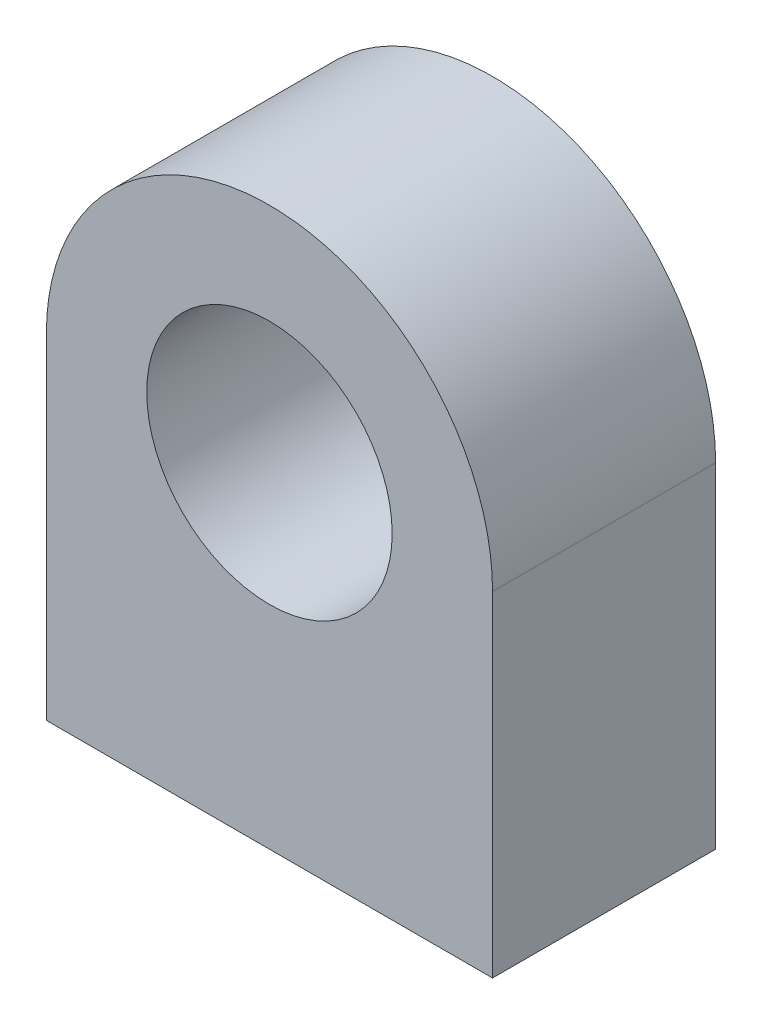
ISO-10303-21;
HEADER;
FILE_DESCRIPTION(('STEP AP214'),'2;1');
FILE_NAME('part.step','',(''),(''),'','','');
FILE_SCHEMA(('AUTOMOTIVE_DESIGN { 1 0 10303 214 1 1 1 1 }'));
ENDSEC;
DATA;
#1=APPLICATION_CONTEXT('core data for automotive mechanical design processes');
#2=APPLICATION_PROTOCOL_DEFINITION('international standard','automotive_design',2000,#1);
#3=PRODUCT_CONTEXT('',#1,'mechanical');
#4=PRODUCT('Part','Part','',(#3));
#5=PRODUCT_RELATED_PRODUCT_CATEGORY('part','',(#4));
#6=PRODUCT_DEFINITION_FORMATION('','',#4);
#7=PRODUCT_DEFINITION_CONTEXT('part definition',#1,'design');
#8=PRODUCT_DEFINITION('design','',#6,#7);
#9=PRODUCT_DEFINITION_SHAPE('','',#8);
#10=(LENGTH_UNIT() NAMED_UNIT(*) SI_UNIT(.MILLI.,.METRE.));
#11=(NAMED_UNIT(*) PLANE_ANGLE_UNIT() SI_UNIT($,.RADIAN.));
#12=(NAMED_UNIT(*) SI_UNIT($,.STERADIAN.) SOLID_ANGLE_UNIT());
#13=UNCERTAINTY_MEASURE_WITH_UNIT(LENGTH_MEASURE(1.E-05),#10,'distance_accuracy_value','');
#14=(GEOMETRIC_REPRESENTATION_CONTEXT(3) GLOBAL_UNCERTAINTY_ASSIGNED_CONTEXT((#13)) GLOBAL_UNIT_ASSIGNED_CONTEXT((#10,
#11,#12)) REPRESENTATION_CONTEXT('',''));
#15=CARTESIAN_POINT('',(0.,0.,0.));
#16=DIRECTION('',(0.,0.,1.));
#17=DIRECTION('',(1.,0.,0.));
#18=AXIS2_PLACEMENT_3D('',#15,#16,#17);
#19=CARTESIAN_POINT('',(0.,0.,10.));
#20=DIRECTION('',(0.,0.,1.));
#21=DIRECTION('',(1.,0.,0.));
#22=AXIS2_PLACEMENT_3D('',#19,#20,#21);
#23=PLANE('',#22);
#24=CARTESIAN_POINT('',(0.,0.,10.));
#25=DIRECTION('',(0.,0.,1.));
#26=DIRECTION('',(1.,0.,0.));
#27=AXIS2_PLACEMENT_3D('',#24,#25,#26);
#28=CIRCLE('',#27,10.);
#29=CARTESIAN_POINT('',(10.,0.,10.));
#30=VERTEX_POINT('',#29);
#31=CARTESIAN_POINT('',(-10.,0.,10.));
#32=VERTEX_POINT('',#31);
#33=EDGE_CURVE('E86',#30,#32,#28,.T.);
#34=ORIENTED_EDGE('',*,*,#33,.T.);
#35=DIRECTION('',(0.,-1.,0.));
#36=VECTOR('',#35,1.);
#37=CARTESIAN_POINT('',(-10.,0.,10.));
#38=LINE('',#37,#36);
#39=CARTESIAN_POINT('',(-10.,-15.,10.));
#40=VERTEX_POINT('',#39);
#41=EDGE_CURVE('E81',#32,#40,#38,.T.);
#42=ORIENTED_EDGE('',*,*,#41,.T.);
#43=DIRECTION('',(1.,0.,0.));
#44=VECTOR('',#43,1.);
#45=CARTESIAN_POINT('',(-10.,-15.,10.));
#46=LINE('',#45,#44);
#47=CARTESIAN_POINT('',(10.,-15.,10.));
#48=VERTEX_POINT('',#47);
#49=EDGE_CURVE('E84',#40,#48,#46,.T.);
#50=ORIENTED_EDGE('',*,*,#49,.T.);
#51=DIRECTION('',(0.,1.,0.));
#52=VECTOR('',#51,1.);
#53=CARTESIAN_POINT('',(10.,0.,10.));
#54=LINE('',#53,#52);
#55=EDGE_CURVE('E51',#48,#30,#54,.T.);
#56=ORIENTED_EDGE('',*,*,#55,.T.);
#57=EDGE_LOOP('',(#34,#42,#50,#56));
#58=FACE_BOUND('',#57,.T.);
#59=CARTESIAN_POINT('',(0.,0.,10.));
#60=DIRECTION('',(0.,0.,1.));
#61=DIRECTION('',(1.,0.,0.));
#62=AXIS2_PLACEMENT_3D('',#59,#60,#61);
#63=CIRCLE('',#62,5.5);
#64=CARTESIAN_POINT('',(5.5,0.,10.));
#65=VERTEX_POINT('',#64);
#66=EDGE_CURVE('E101',#65,#65,#63,.T.);
#67=ORIENTED_EDGE('',*,*,#66,.F.);
#68=EDGE_LOOP('',(#67));
#69=FACE_BOUND('',#68,.T.);
#70=ADVANCED_FACE('F34',(#58,#69),#23,.T.);
#71=CARTESIAN_POINT('',(0.,0.,0.));
#72=DIRECTION('',(0.,0.,1.));
#73=DIRECTION('',(1.,0.,0.));
#74=AXIS2_PLACEMENT_3D('',#71,#72,#73);
#75=PLANE('',#74);
#76=CARTESIAN_POINT('',(0.,0.,0.));
#77=DIRECTION('',(0.,0.,1.));
#78=DIRECTION('',(1.,0.,0.));
#79=AXIS2_PLACEMENT_3D('',#76,#77,#78);
#80=CIRCLE('',#79,10.);
#81=CARTESIAN_POINT('',(10.,0.,0.));
#82=VERTEX_POINT('',#81);
#83=CARTESIAN_POINT('',(-10.,0.,0.));
#84=VERTEX_POINT('',#83);
#85=EDGE_CURVE('E98',#82,#84,#80,.T.);
#86=ORIENTED_EDGE('',*,*,#85,.F.);
#87=DIRECTION('',(0.,1.,0.));
#88=VECTOR('',#87,1.);
#89=CARTESIAN_POINT('',(10.,0.,0.));
#90=LINE('',#89,#88);
#91=CARTESIAN_POINT('',(10.,-15.,0.));
#92=VERTEX_POINT('',#91);
#93=EDGE_CURVE('E74',#92,#82,#90,.T.);
#94=ORIENTED_EDGE('',*,*,#93,.F.);
#95=DIRECTION('',(1.,0.,0.));
#96=VECTOR('',#95,1.);
#97=CARTESIAN_POINT('',(-10.,-15.,0.));
#98=LINE('',#97,#96);
#99=CARTESIAN_POINT('',(-10.,-15.,0.));
#100=VERTEX_POINT('',#99);
#101=EDGE_CURVE('E68',#100,#92,#98,.T.);
#102=ORIENTED_EDGE('',*,*,#101,.F.);
#103=DIRECTION('',(0.,-1.,0.));
#104=VECTOR('',#103,1.);
#105=CARTESIAN_POINT('',(-10.,0.,0.));
#106=LINE('',#105,#104);
#107=EDGE_CURVE('E90',#84,#100,#106,.T.);
#108=ORIENTED_EDGE('',*,*,#107,.F.);
#109=EDGE_LOOP('',(#86,#94,#102,#108));
#110=FACE_BOUND('',#109,.T.);
#111=CARTESIAN_POINT('',(0.,0.,0.));
#112=DIRECTION('',(0.,0.,1.));
#113=DIRECTION('',(1.,0.,0.));
#114=AXIS2_PLACEMENT_3D('',#111,#112,#113);
#115=CIRCLE('',#114,5.5);
#116=CARTESIAN_POINT('',(5.5,0.,0.));
#117=VERTEX_POINT('',#116);
#118=EDGE_CURVE('E113',#117,#117,#115,.T.);
#119=ORIENTED_EDGE('',*,*,#118,.T.);
#120=EDGE_LOOP('',(#119));
#121=FACE_BOUND('',#120,.T.);
#122=ADVANCED_FACE('F109',(#110,#121),#75,.F.);
#123=CARTESIAN_POINT('',(0.,0.,10.));
#124=DIRECTION('',(0.,0.,-1.));
#125=DIRECTION('',(-1.,0.,0.));
#126=AXIS2_PLACEMENT_3D('',#123,#124,#125);
#127=CYLINDRICAL_SURFACE('',#126,10.);
#128=ORIENTED_EDGE('',*,*,#85,.T.);
#129=DIRECTION('',(0.,0.,-1.));
#130=VECTOR('',#129,1.);
#131=CARTESIAN_POINT('',(-10.,0.,10.));
#132=LINE('',#131,#130);
#133=EDGE_CURVE('E11',#32,#84,#132,.T.);
#134=ORIENTED_EDGE('',*,*,#133,.F.);
#135=ORIENTED_EDGE('',*,*,#33,.F.);
#136=DIRECTION('',(0.,0.,-1.));
#137=VECTOR('',#136,1.);
#138=CARTESIAN_POINT('',(10.,0.,10.));
#139=LINE('',#138,#137);
#140=EDGE_CURVE('E94',#30,#82,#139,.T.);
#141=ORIENTED_EDGE('',*,*,#140,.T.);
#142=EDGE_LOOP('',(#128,#134,#135,#141));
#143=FACE_BOUND('',#142,.T.);
#144=ADVANCED_FACE('F36',(#143),#127,.T.);
#145=CARTESIAN_POINT('',(-10.,0.,10.));
#146=DIRECTION('',(1.,0.,0.));
#147=DIRECTION('',(0.,1.,0.));
#148=AXIS2_PLACEMENT_3D('',#145,#146,#147);
#149=PLANE('',#148);
#150=ORIENTED_EDGE('',*,*,#107,.T.);
#151=DIRECTION('',(0.,0.,-1.));
#152=VECTOR('',#151,1.);
#153=CARTESIAN_POINT('',(-10.,-15.,10.));
#154=LINE('',#153,#152);
#155=EDGE_CURVE('E43',#40,#100,#154,.T.);
#156=ORIENTED_EDGE('',*,*,#155,.F.);
#157=ORIENTED_EDGE('',*,*,#41,.F.);
#158=ORIENTED_EDGE('',*,*,#133,.T.);
#159=EDGE_LOOP('',(#150,#156,#157,#158));
#160=FACE_BOUND('',#159,.T.);
#161=ADVANCED_FACE('F89',(#160),#149,.F.);
#162=CARTESIAN_POINT('',(-10.,-15.,10.));
#163=DIRECTION('',(0.,1.,0.));
#164=DIRECTION('',(0.,0.,1.));
#165=AXIS2_PLACEMENT_3D('',#162,#163,#164);
#166=PLANE('',#165);
#167=ORIENTED_EDGE('',*,*,#101,.T.);
#168=DIRECTION('',(0.,0.,-1.));
#169=VECTOR('',#168,1.);
#170=CARTESIAN_POINT('',(10.,-15.,10.));
#171=LINE('',#170,#169);
#172=EDGE_CURVE('E91',#48,#92,#171,.T.);
#173=ORIENTED_EDGE('',*,*,#172,.F.);
#174=ORIENTED_EDGE('',*,*,#49,.F.);
#175=ORIENTED_EDGE('',*,*,#155,.T.);
#176=EDGE_LOOP('',(#167,#173,#174,#175));
#177=FACE_BOUND('',#176,.T.);
#178=ADVANCED_FACE('F92',(#177),#166,.F.);
#179=CARTESIAN_POINT('',(10.,0.,10.));
#180=DIRECTION('',(-1.,0.,0.));
#181=DIRECTION('',(0.,-1.,0.));
#182=AXIS2_PLACEMENT_3D('',#179,#180,#181);
#183=PLANE('',#182);
#184=ORIENTED_EDGE('',*,*,#93,.T.);
#185=ORIENTED_EDGE('',*,*,#140,.F.);
#186=ORIENTED_EDGE('',*,*,#55,.F.);
#187=ORIENTED_EDGE('',*,*,#172,.T.);
#188=EDGE_LOOP('',(#184,#185,#186,#187));
#189=FACE_BOUND('',#188,.T.);
#190=ADVANCED_FACE('F106',(#189),#183,.F.);
#191=CARTESIAN_POINT('',(0.,0.,10.));
#192=DIRECTION('',(0.,0.,-1.));
#193=DIRECTION('',(-1.,0.,0.));
#194=AXIS2_PLACEMENT_3D('',#191,#192,#193);
#195=CYLINDRICAL_SURFACE('',#194,5.5);
#196=ORIENTED_EDGE('',*,*,#66,.T.);
#197=EDGE_LOOP('',(#196));
#198=FACE_BOUND('',#197,.T.);
#199=ORIENTED_EDGE('',*,*,#118,.F.);
#200=EDGE_LOOP('',(#199));
#201=FACE_BOUND('',#200,.T.);
#202=ADVANCED_FACE('F119',(#198,#201),#195,.F.);
#203=CLOSED_SHELL('',(#70,#122,#144,#161,#178,#190,#202));
#204=MANIFOLD_SOLID_BREP('B2',#203);
#205=ADVANCED_BREP_SHAPE_REPRESENTATION('',(#18,#204),#14);
#206=SHAPE_DEFINITION_REPRESENTATION(#9,#205);
ENDSEC;
END-ISO-10303-21;
